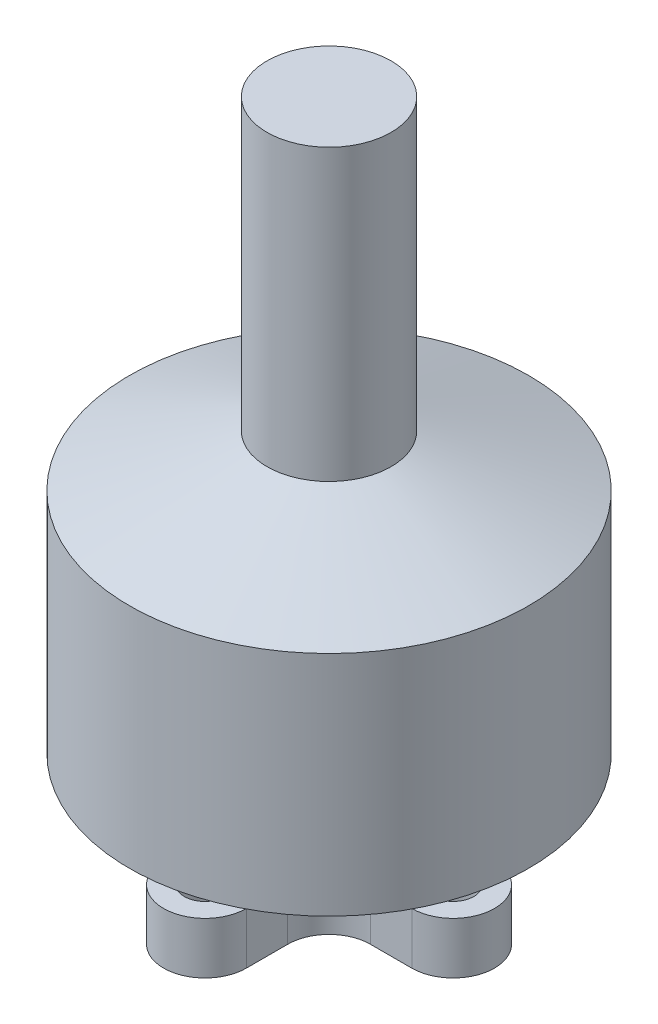
ISO-10303-21;
HEADER;
FILE_DESCRIPTION(('STEP AP214'),'2;1');
FILE_NAME('part.step','',(''),(''),'','','');
FILE_SCHEMA(('AUTOMOTIVE_DESIGN { 1 0 10303 214 1 1 1 1 }'));
ENDSEC;
DATA;
#1=APPLICATION_CONTEXT('core data for automotive mechanical design processes');
#2=APPLICATION_PROTOCOL_DEFINITION('international standard','automotive_design',2000,#1);
#3=PRODUCT_CONTEXT('',#1,'mechanical');
#4=PRODUCT('Part','Part','',(#3));
#5=PRODUCT_RELATED_PRODUCT_CATEGORY('part','',(#4));
#6=PRODUCT_DEFINITION_FORMATION('','',#4);
#7=PRODUCT_DEFINITION_CONTEXT('part definition',#1,'design');
#8=PRODUCT_DEFINITION('design','',#6,#7);
#9=PRODUCT_DEFINITION_SHAPE('','',#8);
#10=(LENGTH_UNIT() NAMED_UNIT(*) SI_UNIT(.MILLI.,.METRE.));
#11=(NAMED_UNIT(*) PLANE_ANGLE_UNIT() SI_UNIT($,.RADIAN.));
#12=(NAMED_UNIT(*) SI_UNIT($,.STERADIAN.) SOLID_ANGLE_UNIT());
#13=UNCERTAINTY_MEASURE_WITH_UNIT(LENGTH_MEASURE(1.E-05),#10,'distance_accuracy_value','');
#14=(GEOMETRIC_REPRESENTATION_CONTEXT(3) GLOBAL_UNCERTAINTY_ASSIGNED_CONTEXT((#13)) GLOBAL_UNIT_ASSIGNED_CONTEXT((#10,
#11,#12)) REPRESENTATION_CONTEXT('',''));
#15=CARTESIAN_POINT('',(0.,0.,0.));
#16=DIRECTION('',(0.,0.,1.));
#17=DIRECTION('',(1.,0.,0.));
#18=AXIS2_PLACEMENT_3D('',#15,#16,#17);
#19=CARTESIAN_POINT('',(0.,2.5,2.));
#20=DIRECTION('',(0.,0.,-1.));
#21=DIRECTION('',(-1.,0.,0.));
#22=AXIS2_PLACEMENT_3D('',#19,#20,#21);
#23=PLANE('',#22);
#24=DIRECTION('',(1.,0.,0.));
#25=VECTOR('',#24,1.);
#26=CARTESIAN_POINT('',(0.,0.,2.));
#27=LINE('',#26,#25);
#28=CARTESIAN_POINT('',(-6.,0.,2.));
#29=VERTEX_POINT('',#28);
#30=CARTESIAN_POINT('',(-4.,0.,2.));
#31=VERTEX_POINT('',#30);
#32=EDGE_CURVE('E217',#29,#31,#27,.T.);
#33=ORIENTED_EDGE('',*,*,#32,.T.);
#34=DIRECTION('',(0.,-1.,0.));
#35=VECTOR('',#34,1.);
#36=CARTESIAN_POINT('',(-4.,2.5,2.));
#37=LINE('',#36,#35);
#38=CARTESIAN_POINT('',(-4.,2.5,2.));
#39=VERTEX_POINT('',#38);
#40=EDGE_CURVE('E56',#31,#39,#37,.F.);
#41=ORIENTED_EDGE('',*,*,#40,.T.);
#42=DIRECTION('',(1.,0.,0.));
#43=VECTOR('',#42,1.);
#44=CARTESIAN_POINT('',(0.,2.5,2.));
#45=LINE('',#44,#43);
#46=CARTESIAN_POINT('',(-6.,2.5,2.));
#47=VERTEX_POINT('',#46);
#48=EDGE_CURVE('E167',#47,#39,#45,.T.);
#49=ORIENTED_EDGE('',*,*,#48,.F.);
#50=DIRECTION('',(0.,-1.,0.));
#51=VECTOR('',#50,1.);
#52=CARTESIAN_POINT('',(-6.,2.5,2.));
#53=LINE('',#52,#51);
#54=EDGE_CURVE('E216',#47,#29,#53,.T.);
#55=ORIENTED_EDGE('',*,*,#54,.T.);
#56=EDGE_LOOP('',(#33,#41,#49,#55));
#57=FACE_BOUND('',#56,.T.);
#58=ADVANCED_FACE('F41',(#57),#23,.F.);
#59=CARTESIAN_POINT('',(-2.,2.5,0.));
#60=DIRECTION('',(1.,0.,0.));
#61=DIRECTION('',(0.,0.,-1.));
#62=AXIS2_PLACEMENT_3D('',#59,#60,#61);
#63=PLANE('',#62);
#64=DIRECTION('',(0.,0.,1.));
#65=VECTOR('',#64,1.);
#66=CARTESIAN_POINT('',(-2.,2.5,0.));
#67=LINE('',#66,#65);
#68=CARTESIAN_POINT('',(-2.,2.5,4.));
#69=VERTEX_POINT('',#68);
#70=CARTESIAN_POINT('',(-2.,2.5,6.));
#71=VERTEX_POINT('',#70);
#72=EDGE_CURVE('E155',#69,#71,#67,.T.);
#73=ORIENTED_EDGE('',*,*,#72,.F.);
#74=DIRECTION('',(0.,-1.,0.));
#75=VECTOR('',#74,1.);
#76=CARTESIAN_POINT('',(-2.,0.,4.));
#77=LINE('',#76,#75);
#78=CARTESIAN_POINT('',(-2.,0.,4.));
#79=VERTEX_POINT('',#78);
#80=EDGE_CURVE('E288',#69,#79,#77,.T.);
#81=ORIENTED_EDGE('',*,*,#80,.T.);
#82=DIRECTION('',(0.,0.,1.));
#83=VECTOR('',#82,1.);
#84=CARTESIAN_POINT('',(-2.,0.,0.));
#85=LINE('',#84,#83);
#86=CARTESIAN_POINT('',(-2.,0.,6.));
#87=VERTEX_POINT('',#86);
#88=EDGE_CURVE('E172',#79,#87,#85,.T.);
#89=ORIENTED_EDGE('',*,*,#88,.T.);
#90=DIRECTION('',(0.,-1.,0.));
#91=VECTOR('',#90,1.);
#92=CARTESIAN_POINT('',(-2.,2.5,6.));
#93=LINE('',#92,#91);
#94=EDGE_CURVE('E170',#71,#87,#93,.T.);
#95=ORIENTED_EDGE('',*,*,#94,.F.);
#96=EDGE_LOOP('',(#73,#81,#89,#95));
#97=FACE_BOUND('',#96,.T.);
#98=ADVANCED_FACE('F171',(#97),#63,.F.);
#99=CARTESIAN_POINT('',(0.,2.5,6.));
#100=DIRECTION('',(0.,-1.,0.));
#101=DIRECTION('',(0.,0.,-1.));
#102=AXIS2_PLACEMENT_3D('',#99,#100,#101);
#103=CYLINDRICAL_SURFACE('',#102,2.);
#104=CARTESIAN_POINT('',(0.,0.,6.));
#105=DIRECTION('',(0.,1.,0.));
#106=DIRECTION('',(0.,0.,1.));
#107=AXIS2_PLACEMENT_3D('',#104,#105,#106);
#108=CIRCLE('',#107,2.);
#109=CARTESIAN_POINT('',(2.,0.,6.));
#110=VERTEX_POINT('',#109);
#111=EDGE_CURVE('E221',#87,#110,#108,.T.);
#112=ORIENTED_EDGE('',*,*,#111,.T.);
#113=DIRECTION('',(0.,-1.,0.));
#114=VECTOR('',#113,1.);
#115=CARTESIAN_POINT('',(2.,2.5,6.));
#116=LINE('',#115,#114);
#117=CARTESIAN_POINT('',(2.,2.5,6.));
#118=VERTEX_POINT('',#117);
#119=EDGE_CURVE('E176',#118,#110,#116,.T.);
#120=ORIENTED_EDGE('',*,*,#119,.F.);
#121=CARTESIAN_POINT('',(0.,2.5,6.));
#122=DIRECTION('',(0.,1.,0.));
#123=DIRECTION('',(0.,0.,1.));
#124=AXIS2_PLACEMENT_3D('',#121,#122,#123);
#125=CIRCLE('',#124,2.);
#126=EDGE_CURVE('E161',#71,#118,#125,.T.);
#127=ORIENTED_EDGE('',*,*,#126,.F.);
#128=ORIENTED_EDGE('',*,*,#94,.T.);
#129=EDGE_LOOP('',(#112,#120,#127,#128));
#130=FACE_BOUND('',#129,.T.);
#131=ADVANCED_FACE('F178',(#130),#103,.T.);
#132=CARTESIAN_POINT('',(2.,2.5,0.));
#133=DIRECTION('',(-1.,0.,0.));
#134=DIRECTION('',(0.,0.,1.));
#135=AXIS2_PLACEMENT_3D('',#132,#133,#134);
#136=PLANE('',#135);
#137=DIRECTION('',(0.,0.,-1.));
#138=VECTOR('',#137,1.);
#139=CARTESIAN_POINT('',(2.,0.,0.));
#140=LINE('',#139,#138);
#141=CARTESIAN_POINT('',(2.,0.,4.));
#142=VERTEX_POINT('',#141);
#143=EDGE_CURVE('E223',#110,#142,#140,.T.);
#144=ORIENTED_EDGE('',*,*,#143,.T.);
#145=DIRECTION('',(0.,-1.,0.));
#146=VECTOR('',#145,1.);
#147=CARTESIAN_POINT('',(2.,2.5,4.));
#148=LINE('',#147,#146);
#149=CARTESIAN_POINT('',(2.,2.5,4.));
#150=VERTEX_POINT('',#149);
#151=EDGE_CURVE('E286',#142,#150,#148,.F.);
#152=ORIENTED_EDGE('',*,*,#151,.T.);
#153=DIRECTION('',(0.,0.,-1.));
#154=VECTOR('',#153,1.);
#155=CARTESIAN_POINT('',(2.,2.5,0.));
#156=LINE('',#155,#154);
#157=EDGE_CURVE('E181',#118,#150,#156,.T.);
#158=ORIENTED_EDGE('',*,*,#157,.F.);
#159=ORIENTED_EDGE('',*,*,#119,.T.);
#160=EDGE_LOOP('',(#144,#152,#158,#159));
#161=FACE_BOUND('',#160,.T.);
#162=ADVANCED_FACE('F319',(#161),#136,.F.);
#163=CARTESIAN_POINT('',(0.,2.5,2.));
#164=DIRECTION('',(0.,0.,-1.));
#165=DIRECTION('',(-1.,0.,0.));
#166=AXIS2_PLACEMENT_3D('',#163,#164,#165);
#167=PLANE('',#166);
#168=DIRECTION('',(1.,0.,0.));
#169=VECTOR('',#168,1.);
#170=CARTESIAN_POINT('',(0.,2.5,2.));
#171=LINE('',#170,#169);
#172=CARTESIAN_POINT('',(4.,2.5,2.));
#173=VERTEX_POINT('',#172);
#174=CARTESIAN_POINT('',(6.,2.5,2.));
#175=VERTEX_POINT('',#174);
#176=EDGE_CURVE('E183',#173,#175,#171,.T.);
#177=ORIENTED_EDGE('',*,*,#176,.F.);
#178=DIRECTION('',(0.,-1.,0.));
#179=VECTOR('',#178,1.);
#180=CARTESIAN_POINT('',(4.,0.,2.));
#181=LINE('',#180,#179);
#182=CARTESIAN_POINT('',(4.,0.,2.));
#183=VERTEX_POINT('',#182);
#184=EDGE_CURVE('E283',#173,#183,#181,.T.);
#185=ORIENTED_EDGE('',*,*,#184,.T.);
#186=DIRECTION('',(1.,0.,0.));
#187=VECTOR('',#186,1.);
#188=CARTESIAN_POINT('',(0.,0.,2.));
#189=LINE('',#188,#187);
#190=CARTESIAN_POINT('',(6.,0.,2.));
#191=VERTEX_POINT('',#190);
#192=EDGE_CURVE('E226',#183,#191,#189,.T.);
#193=ORIENTED_EDGE('',*,*,#192,.T.);
#194=DIRECTION('',(0.,-1.,0.));
#195=VECTOR('',#194,1.);
#196=CARTESIAN_POINT('',(6.,2.5,2.));
#197=LINE('',#196,#195);
#198=EDGE_CURVE('E270',#175,#191,#197,.T.);
#199=ORIENTED_EDGE('',*,*,#198,.F.);
#200=EDGE_LOOP('',(#177,#185,#193,#199));
#201=FACE_BOUND('',#200,.T.);
#202=ADVANCED_FACE('F310',(#201),#167,.F.);
#203=CARTESIAN_POINT('',(6.,2.5,0.));
#204=DIRECTION('',(0.,-1.,0.));
#205=DIRECTION('',(0.,0.,-1.));
#206=AXIS2_PLACEMENT_3D('',#203,#204,#205);
#207=CYLINDRICAL_SURFACE('',#206,2.);
#208=CARTESIAN_POINT('',(6.,0.,0.));
#209=DIRECTION('',(0.,1.,0.));
#210=DIRECTION('',(0.,0.,1.));
#211=AXIS2_PLACEMENT_3D('',#208,#209,#210);
#212=CIRCLE('',#211,2.);
#213=CARTESIAN_POINT('',(6.,0.,-2.));
#214=VERTEX_POINT('',#213);
#215=EDGE_CURVE('E228',#191,#214,#212,.T.);
#216=ORIENTED_EDGE('',*,*,#215,.T.);
#217=DIRECTION('',(0.,-1.,0.));
#218=VECTOR('',#217,1.);
#219=CARTESIAN_POINT('',(6.,2.5,-2.));
#220=LINE('',#219,#218);
#221=CARTESIAN_POINT('',(6.,2.5,-2.));
#222=VERTEX_POINT('',#221);
#223=EDGE_CURVE('E267',#222,#214,#220,.T.);
#224=ORIENTED_EDGE('',*,*,#223,.F.);
#225=CARTESIAN_POINT('',(6.,2.5,0.));
#226=DIRECTION('',(0.,1.,0.));
#227=DIRECTION('',(0.,0.,1.));
#228=AXIS2_PLACEMENT_3D('',#225,#226,#227);
#229=CIRCLE('',#228,2.);
#230=EDGE_CURVE('E188',#175,#222,#229,.T.);
#231=ORIENTED_EDGE('',*,*,#230,.F.);
#232=ORIENTED_EDGE('',*,*,#198,.T.);
#233=EDGE_LOOP('',(#216,#224,#231,#232));
#234=FACE_BOUND('',#233,.T.);
#235=ADVANCED_FACE('F326',(#234),#207,.T.);
#236=CARTESIAN_POINT('',(0.,2.5,-2.));
#237=DIRECTION('',(0.,0.,1.));
#238=DIRECTION('',(1.,0.,0.));
#239=AXIS2_PLACEMENT_3D('',#236,#237,#238);
#240=PLANE('',#239);
#241=DIRECTION('',(-1.,0.,0.));
#242=VECTOR('',#241,1.);
#243=CARTESIAN_POINT('',(0.,0.,-2.));
#244=LINE('',#243,#242);
#245=CARTESIAN_POINT('',(4.,0.,-2.));
#246=VERTEX_POINT('',#245);
#247=EDGE_CURVE('E230',#214,#246,#244,.T.);
#248=ORIENTED_EDGE('',*,*,#247,.T.);
#249=DIRECTION('',(0.,-1.,0.));
#250=VECTOR('',#249,1.);
#251=CARTESIAN_POINT('',(4.,2.5,-2.));
#252=LINE('',#251,#250);
#253=CARTESIAN_POINT('',(4.,2.5,-2.));
#254=VERTEX_POINT('',#253);
#255=EDGE_CURVE('E281',#246,#254,#252,.F.);
#256=ORIENTED_EDGE('',*,*,#255,.T.);
#257=DIRECTION('',(-1.,0.,0.));
#258=VECTOR('',#257,1.);
#259=CARTESIAN_POINT('',(0.,2.5,-2.));
#260=LINE('',#259,#258);
#261=EDGE_CURVE('E190',#222,#254,#260,.T.);
#262=ORIENTED_EDGE('',*,*,#261,.F.);
#263=ORIENTED_EDGE('',*,*,#223,.T.);
#264=EDGE_LOOP('',(#248,#256,#262,#263));
#265=FACE_BOUND('',#264,.T.);
#266=ADVANCED_FACE('F405',(#265),#240,.F.);
#267=CARTESIAN_POINT('',(2.,2.5,0.));
#268=DIRECTION('',(-1.,0.,0.));
#269=DIRECTION('',(0.,0.,1.));
#270=AXIS2_PLACEMENT_3D('',#267,#268,#269);
#271=PLANE('',#270);
#272=DIRECTION('',(0.,0.,-1.));
#273=VECTOR('',#272,1.);
#274=CARTESIAN_POINT('',(2.,2.5,0.));
#275=LINE('',#274,#273);
#276=CARTESIAN_POINT('',(2.,2.5,-4.));
#277=VERTEX_POINT('',#276);
#278=CARTESIAN_POINT('',(2.,2.5,-6.));
#279=VERTEX_POINT('',#278);
#280=EDGE_CURVE('E193',#277,#279,#275,.T.);
#281=ORIENTED_EDGE('',*,*,#280,.F.);
#282=DIRECTION('',(0.,-1.,0.));
#283=VECTOR('',#282,1.);
#284=CARTESIAN_POINT('',(2.,0.,-4.));
#285=LINE('',#284,#283);
#286=CARTESIAN_POINT('',(2.,0.,-4.));
#287=VERTEX_POINT('',#286);
#288=EDGE_CURVE('E278',#277,#287,#285,.T.);
#289=ORIENTED_EDGE('',*,*,#288,.T.);
#290=DIRECTION('',(0.,0.,-1.));
#291=VECTOR('',#290,1.);
#292=CARTESIAN_POINT('',(2.,0.,0.));
#293=LINE('',#292,#291);
#294=CARTESIAN_POINT('',(2.,0.,-6.));
#295=VERTEX_POINT('',#294);
#296=EDGE_CURVE('E233',#287,#295,#293,.T.);
#297=ORIENTED_EDGE('',*,*,#296,.T.);
#298=DIRECTION('',(0.,-1.,0.));
#299=VECTOR('',#298,1.);
#300=CARTESIAN_POINT('',(2.,2.5,-6.));
#301=LINE('',#300,#299);
#302=EDGE_CURVE('E264',#279,#295,#301,.T.);
#303=ORIENTED_EDGE('',*,*,#302,.F.);
#304=EDGE_LOOP('',(#281,#289,#297,#303));
#305=FACE_BOUND('',#304,.T.);
#306=ADVANCED_FACE('F401',(#305),#271,.F.);
#307=CARTESIAN_POINT('',(0.,2.5,-6.));
#308=DIRECTION('',(0.,-1.,0.));
#309=DIRECTION('',(0.,0.,-1.));
#310=AXIS2_PLACEMENT_3D('',#307,#308,#309);
#311=CYLINDRICAL_SURFACE('',#310,2.);
#312=CARTESIAN_POINT('',(0.,0.,-6.));
#313=DIRECTION('',(0.,1.,0.));
#314=DIRECTION('',(0.,0.,1.));
#315=AXIS2_PLACEMENT_3D('',#312,#313,#314);
#316=CIRCLE('',#315,2.);
#317=CARTESIAN_POINT('',(-2.,0.,-6.));
#318=VERTEX_POINT('',#317);
#319=EDGE_CURVE('E235',#295,#318,#316,.T.);
#320=ORIENTED_EDGE('',*,*,#319,.T.);
#321=DIRECTION('',(0.,-1.,0.));
#322=VECTOR('',#321,1.);
#323=CARTESIAN_POINT('',(-2.,2.5,-6.));
#324=LINE('',#323,#322);
#325=CARTESIAN_POINT('',(-2.,2.5,-6.));
#326=VERTEX_POINT('',#325);
#327=EDGE_CURVE('E261',#326,#318,#324,.T.);
#328=ORIENTED_EDGE('',*,*,#327,.F.);
#329=CARTESIAN_POINT('',(0.,2.5,-6.));
#330=DIRECTION('',(0.,1.,0.));
#331=DIRECTION('',(0.,0.,1.));
#332=AXIS2_PLACEMENT_3D('',#329,#330,#331);
#333=CIRCLE('',#332,2.);
#334=EDGE_CURVE('E195',#279,#326,#333,.T.);
#335=ORIENTED_EDGE('',*,*,#334,.F.);
#336=ORIENTED_EDGE('',*,*,#302,.T.);
#337=EDGE_LOOP('',(#320,#328,#335,#336));
#338=FACE_BOUND('',#337,.T.);
#339=ADVANCED_FACE('F397',(#338),#311,.T.);
#340=CARTESIAN_POINT('',(-2.,2.5,0.));
#341=DIRECTION('',(1.,0.,0.));
#342=DIRECTION('',(0.,0.,-1.));
#343=AXIS2_PLACEMENT_3D('',#340,#341,#342);
#344=PLANE('',#343);
#345=DIRECTION('',(0.,0.,1.));
#346=VECTOR('',#345,1.);
#347=CARTESIAN_POINT('',(-2.,0.,0.));
#348=LINE('',#347,#346);
#349=CARTESIAN_POINT('',(-2.,0.,-4.));
#350=VERTEX_POINT('',#349);
#351=EDGE_CURVE('E237',#318,#350,#348,.T.);
#352=ORIENTED_EDGE('',*,*,#351,.T.);
#353=DIRECTION('',(0.,-1.,0.));
#354=VECTOR('',#353,1.);
#355=CARTESIAN_POINT('',(-2.,2.5,-4.));
#356=LINE('',#355,#354);
#357=CARTESIAN_POINT('',(-2.,2.5,-4.));
#358=VERTEX_POINT('',#357);
#359=EDGE_CURVE('E276',#350,#358,#356,.F.);
#360=ORIENTED_EDGE('',*,*,#359,.T.);
#361=DIRECTION('',(0.,0.,1.));
#362=VECTOR('',#361,1.);
#363=CARTESIAN_POINT('',(-2.,2.5,0.));
#364=LINE('',#363,#362);
#365=EDGE_CURVE('E197',#326,#358,#364,.T.);
#366=ORIENTED_EDGE('',*,*,#365,.F.);
#367=ORIENTED_EDGE('',*,*,#327,.T.);
#368=EDGE_LOOP('',(#352,#360,#366,#367));
#369=FACE_BOUND('',#368,.T.);
#370=ADVANCED_FACE('F393',(#369),#344,.F.);
#371=CARTESIAN_POINT('',(0.,2.5,-2.));
#372=DIRECTION('',(0.,0.,1.));
#373=DIRECTION('',(1.,0.,0.));
#374=AXIS2_PLACEMENT_3D('',#371,#372,#373);
#375=PLANE('',#374);
#376=DIRECTION('',(-1.,0.,0.));
#377=VECTOR('',#376,1.);
#378=CARTESIAN_POINT('',(0.,2.5,-2.));
#379=LINE('',#378,#377);
#380=CARTESIAN_POINT('',(-4.,2.5,-2.));
#381=VERTEX_POINT('',#380);
#382=CARTESIAN_POINT('',(-6.,2.5,-2.));
#383=VERTEX_POINT('',#382);
#384=EDGE_CURVE('E200',#381,#383,#379,.T.);
#385=ORIENTED_EDGE('',*,*,#384,.F.);
#386=DIRECTION('',(0.,-1.,0.));
#387=VECTOR('',#386,1.);
#388=CARTESIAN_POINT('',(-4.,0.,-2.));
#389=LINE('',#388,#387);
#390=CARTESIAN_POINT('',(-4.,0.,-2.));
#391=VERTEX_POINT('',#390);
#392=EDGE_CURVE('E175',#381,#391,#389,.T.);
#393=ORIENTED_EDGE('',*,*,#392,.T.);
#394=DIRECTION('',(-1.,0.,0.));
#395=VECTOR('',#394,1.);
#396=CARTESIAN_POINT('',(0.,0.,-2.));
#397=LINE('',#396,#395);
#398=CARTESIAN_POINT('',(-6.,0.,-2.));
#399=VERTEX_POINT('',#398);
#400=EDGE_CURVE('E240',#391,#399,#397,.T.);
#401=ORIENTED_EDGE('',*,*,#400,.T.);
#402=DIRECTION('',(0.,-1.,0.));
#403=VECTOR('',#402,1.);
#404=CARTESIAN_POINT('',(-6.,2.5,-2.));
#405=LINE('',#404,#403);
#406=EDGE_CURVE('E258',#383,#399,#405,.T.);
#407=ORIENTED_EDGE('',*,*,#406,.F.);
#408=EDGE_LOOP('',(#385,#393,#401,#407));
#409=FACE_BOUND('',#408,.T.);
#410=ADVANCED_FACE('F379',(#409),#375,.F.);
#411=CARTESIAN_POINT('',(6.,2.5,0.));
#412=DIRECTION('',(0.,-1.,0.));
#413=DIRECTION('',(0.,0.,-1.));
#414=AXIS2_PLACEMENT_3D('',#411,#412,#413);
#415=CYLINDRICAL_SURFACE('',#414,1.);
#416=CARTESIAN_POINT('',(6.,2.5,0.));
#417=DIRECTION('',(0.,1.,0.));
#418=DIRECTION('',(0.,0.,1.));
#419=AXIS2_PLACEMENT_3D('',#416,#417,#418);
#420=CIRCLE('',#419,1.);
#421=CARTESIAN_POINT('',(6.,2.5,1.));
#422=VERTEX_POINT('',#421);
#423=EDGE_CURVE('E210',#422,#422,#420,.T.);
#424=ORIENTED_EDGE('',*,*,#423,.T.);
#425=EDGE_LOOP('',(#424));
#426=FACE_BOUND('',#425,.T.);
#427=CARTESIAN_POINT('',(6.,0.,0.));
#428=DIRECTION('',(0.,1.,0.));
#429=DIRECTION('',(0.,0.,1.));
#430=AXIS2_PLACEMENT_3D('',#427,#428,#429);
#431=CIRCLE('',#430,1.);
#432=CARTESIAN_POINT('',(6.,0.,1.));
#433=VERTEX_POINT('',#432);
#434=EDGE_CURVE('E250',#433,#433,#431,.T.);
#435=ORIENTED_EDGE('',*,*,#434,.F.);
#436=EDGE_LOOP('',(#435));
#437=FACE_BOUND('',#436,.T.);
#438=ADVANCED_FACE('F375',(#426,#437),#415,.F.);
#439=CARTESIAN_POINT('',(0.,2.5,-6.));
#440=DIRECTION('',(0.,-1.,0.));
#441=DIRECTION('',(0.,0.,-1.));
#442=AXIS2_PLACEMENT_3D('',#439,#440,#441);
#443=CYLINDRICAL_SURFACE('',#442,1.);
#444=CARTESIAN_POINT('',(0.,2.5,-6.));
#445=DIRECTION('',(0.,1.,0.));
#446=DIRECTION('',(0.,0.,1.));
#447=AXIS2_PLACEMENT_3D('',#444,#445,#446);
#448=CIRCLE('',#447,1.);
#449=CARTESIAN_POINT('',(0.,2.5,-5.));
#450=VERTEX_POINT('',#449);
#451=EDGE_CURVE('E207',#450,#450,#448,.T.);
#452=ORIENTED_EDGE('',*,*,#451,.T.);
#453=EDGE_LOOP('',(#452));
#454=FACE_BOUND('',#453,.T.);
#455=CARTESIAN_POINT('',(0.,0.,-6.));
#456=DIRECTION('',(0.,1.,0.));
#457=DIRECTION('',(0.,0.,1.));
#458=AXIS2_PLACEMENT_3D('',#455,#456,#457);
#459=CIRCLE('',#458,1.);
#460=CARTESIAN_POINT('',(0.,0.,-5.));
#461=VERTEX_POINT('',#460);
#462=EDGE_CURVE('E247',#461,#461,#459,.T.);
#463=ORIENTED_EDGE('',*,*,#462,.F.);
#464=EDGE_LOOP('',(#463));
#465=FACE_BOUND('',#464,.T.);
#466=ADVANCED_FACE('F378',(#454,#465),#443,.F.);
#467=CARTESIAN_POINT('',(-6.,2.5,0.));
#468=DIRECTION('',(0.,-1.,0.));
#469=DIRECTION('',(0.,0.,-1.));
#470=AXIS2_PLACEMENT_3D('',#467,#468,#469);
#471=CYLINDRICAL_SURFACE('',#470,1.);
#472=CARTESIAN_POINT('',(-6.,2.5,0.));
#473=DIRECTION('',(0.,1.,0.));
#474=DIRECTION('',(0.,0.,1.));
#475=AXIS2_PLACEMENT_3D('',#472,#473,#474);
#476=CIRCLE('',#475,1.);
#477=CARTESIAN_POINT('',(-6.,2.5,1.));
#478=VERTEX_POINT('',#477);
#479=EDGE_CURVE('E204',#478,#478,#476,.T.);
#480=ORIENTED_EDGE('',*,*,#479,.T.);
#481=EDGE_LOOP('',(#480));
#482=FACE_BOUND('',#481,.T.);
#483=CARTESIAN_POINT('',(-6.,0.,0.));
#484=DIRECTION('',(0.,1.,0.));
#485=DIRECTION('',(0.,0.,1.));
#486=AXIS2_PLACEMENT_3D('',#483,#484,#485);
#487=CIRCLE('',#486,1.);
#488=CARTESIAN_POINT('',(-6.,0.,1.));
#489=VERTEX_POINT('',#488);
#490=EDGE_CURVE('E244',#489,#489,#487,.T.);
#491=ORIENTED_EDGE('',*,*,#490,.F.);
#492=EDGE_LOOP('',(#491));
#493=FACE_BOUND('',#492,.T.);
#494=ADVANCED_FACE('F383',(#482,#493),#471,.F.);
#495=CARTESIAN_POINT('',(-6.,2.5,0.));
#496=DIRECTION('',(0.,-1.,0.));
#497=DIRECTION('',(0.,0.,-1.));
#498=AXIS2_PLACEMENT_3D('',#495,#496,#497);
#499=CYLINDRICAL_SURFACE('',#498,2.);
#500=CARTESIAN_POINT('',(-6.,0.,0.));
#501=DIRECTION('',(0.,1.,0.));
#502=DIRECTION('',(0.,0.,1.));
#503=AXIS2_PLACEMENT_3D('',#500,#501,#502);
#504=CIRCLE('',#503,2.);
#505=EDGE_CURVE('E242',#399,#29,#504,.T.);
#506=ORIENTED_EDGE('',*,*,#505,.T.);
#507=ORIENTED_EDGE('',*,*,#54,.F.);
#508=CARTESIAN_POINT('',(-6.,2.5,0.));
#509=DIRECTION('',(0.,1.,0.));
#510=DIRECTION('',(0.,0.,1.));
#511=AXIS2_PLACEMENT_3D('',#508,#509,#510);
#512=CIRCLE('',#511,2.);
#513=EDGE_CURVE('E202',#383,#47,#512,.T.);
#514=ORIENTED_EDGE('',*,*,#513,.F.);
#515=ORIENTED_EDGE('',*,*,#406,.T.);
#516=EDGE_LOOP('',(#506,#507,#514,#515));
#517=FACE_BOUND('',#516,.T.);
#518=ADVANCED_FACE('F373',(#517),#499,.T.);
#519=CARTESIAN_POINT('',(0.,2.5,6.));
#520=DIRECTION('',(0.,-1.,0.));
#521=DIRECTION('',(0.,0.,-1.));
#522=AXIS2_PLACEMENT_3D('',#519,#520,#521);
#523=CYLINDRICAL_SURFACE('',#522,1.);
#524=CARTESIAN_POINT('',(0.,2.5,6.));
#525=DIRECTION('',(0.,1.,0.));
#526=DIRECTION('',(0.,0.,1.));
#527=AXIS2_PLACEMENT_3D('',#524,#525,#526);
#528=CIRCLE('',#527,1.);
#529=CARTESIAN_POINT('',(0.,2.5,7.));
#530=VERTEX_POINT('',#529);
#531=EDGE_CURVE('E213',#530,#530,#528,.T.);
#532=ORIENTED_EDGE('',*,*,#531,.T.);
#533=EDGE_LOOP('',(#532));
#534=FACE_BOUND('',#533,.T.);
#535=CARTESIAN_POINT('',(0.,0.,6.));
#536=DIRECTION('',(0.,1.,0.));
#537=DIRECTION('',(0.,0.,1.));
#538=AXIS2_PLACEMENT_3D('',#535,#536,#537);
#539=CIRCLE('',#538,1.);
#540=CARTESIAN_POINT('',(0.,0.,7.));
#541=VERTEX_POINT('',#540);
#542=EDGE_CURVE('E253',#541,#541,#539,.T.);
#543=ORIENTED_EDGE('',*,*,#542,.F.);
#544=EDGE_LOOP('',(#543));
#545=FACE_BOUND('',#544,.T.);
#546=ADVANCED_FACE('F367',(#534,#545),#523,.F.);
#547=CARTESIAN_POINT('',(0.,2.5,0.));
#548=DIRECTION('',(0.,1.,0.));
#549=DIRECTION('',(0.,0.,1.));
#550=AXIS2_PLACEMENT_3D('',#547,#548,#549);
#551=PLANE('',#550);
#552=CARTESIAN_POINT('',(0.,2.5,0.));
#553=DIRECTION('',(0.,1.,0.));
#554=DIRECTION('',(0.,0.,1.));
#555=AXIS2_PLACEMENT_3D('',#552,#553,#554);
#556=CIRCLE('',#555,3.5);
#557=CARTESIAN_POINT('',(0.,2.5,3.5));
#558=VERTEX_POINT('',#557);
#559=EDGE_CURVE('E11',#558,#558,#556,.T.);
#560=ORIENTED_EDGE('',*,*,#559,.F.);
#561=EDGE_LOOP('',(#560));
#562=FACE_BOUND('',#561,.T.);
#563=ORIENTED_EDGE('',*,*,#48,.T.);
#564=CARTESIAN_POINT('',(-4.,2.5,4.));
#565=DIRECTION('',(0.,1.,0.));
#566=DIRECTION('',(0.,0.,1.));
#567=AXIS2_PLACEMENT_3D('',#564,#565,#566);
#568=CIRCLE('',#567,2.);
#569=EDGE_CURVE('E49',#39,#69,#568,.F.);
#570=ORIENTED_EDGE('',*,*,#569,.T.);
#571=ORIENTED_EDGE('',*,*,#72,.T.);
#572=ORIENTED_EDGE('',*,*,#126,.T.);
#573=ORIENTED_EDGE('',*,*,#157,.T.);
#574=CARTESIAN_POINT('',(4.,2.5,4.));
#575=DIRECTION('',(0.,1.,0.));
#576=DIRECTION('',(0.,0.,1.));
#577=AXIS2_PLACEMENT_3D('',#574,#575,#576);
#578=CIRCLE('',#577,2.);
#579=EDGE_CURVE('E301',#150,#173,#578,.F.);
#580=ORIENTED_EDGE('',*,*,#579,.T.);
#581=ORIENTED_EDGE('',*,*,#176,.T.);
#582=ORIENTED_EDGE('',*,*,#230,.T.);
#583=ORIENTED_EDGE('',*,*,#261,.T.);
#584=CARTESIAN_POINT('',(4.,2.5,-4.));
#585=DIRECTION('',(0.,1.,0.));
#586=DIRECTION('',(0.,0.,1.));
#587=AXIS2_PLACEMENT_3D('',#584,#585,#586);
#588=CIRCLE('',#587,2.);
#589=EDGE_CURVE('E297',#254,#277,#588,.F.);
#590=ORIENTED_EDGE('',*,*,#589,.T.);
#591=ORIENTED_EDGE('',*,*,#280,.T.);
#592=ORIENTED_EDGE('',*,*,#334,.T.);
#593=ORIENTED_EDGE('',*,*,#365,.T.);
#594=CARTESIAN_POINT('',(-4.,2.5,-4.));
#595=DIRECTION('',(0.,1.,0.));
#596=DIRECTION('',(0.,0.,1.));
#597=AXIS2_PLACEMENT_3D('',#594,#595,#596);
#598=CIRCLE('',#597,2.);
#599=EDGE_CURVE('E293',#358,#381,#598,.F.);
#600=ORIENTED_EDGE('',*,*,#599,.T.);
#601=ORIENTED_EDGE('',*,*,#384,.T.);
#602=ORIENTED_EDGE('',*,*,#513,.T.);
#603=EDGE_LOOP('',(#563,#570,#571,#572,#573,#580,#581,#582,#583,#590,#591,#592,#593,#600,#601,#602));
#604=FACE_BOUND('',#603,.T.);
#605=ORIENTED_EDGE('',*,*,#479,.F.);
#606=EDGE_LOOP('',(#605));
#607=FACE_BOUND('',#606,.T.);
#608=ORIENTED_EDGE('',*,*,#451,.F.);
#609=EDGE_LOOP('',(#608));
#610=FACE_BOUND('',#609,.T.);
#611=ORIENTED_EDGE('',*,*,#423,.F.);
#612=EDGE_LOOP('',(#611));
#613=FACE_BOUND('',#612,.T.);
#614=ORIENTED_EDGE('',*,*,#531,.F.);
#615=EDGE_LOOP('',(#614));
#616=FACE_BOUND('',#615,.T.);
#617=ADVANCED_FACE('F157',(#562,#604,#607,#610,#613,#616),#551,.T.);
#618=CARTESIAN_POINT('',(0.,0.,0.));
#619=DIRECTION('',(0.,1.,0.));
#620=DIRECTION('',(0.,0.,1.));
#621=AXIS2_PLACEMENT_3D('',#618,#619,#620);
#622=PLANE('',#621);
#623=ORIENTED_EDGE('',*,*,#32,.F.);
#624=ORIENTED_EDGE('',*,*,#505,.F.);
#625=ORIENTED_EDGE('',*,*,#400,.F.);
#626=CARTESIAN_POINT('',(-4.,0.,-4.));
#627=DIRECTION('',(0.,1.,0.));
#628=DIRECTION('',(0.,0.,1.));
#629=AXIS2_PLACEMENT_3D('',#626,#627,#628);
#630=CIRCLE('',#629,2.);
#631=EDGE_CURVE('E291',#391,#350,#630,.T.);
#632=ORIENTED_EDGE('',*,*,#631,.T.);
#633=ORIENTED_EDGE('',*,*,#351,.F.);
#634=ORIENTED_EDGE('',*,*,#319,.F.);
#635=ORIENTED_EDGE('',*,*,#296,.F.);
#636=CARTESIAN_POINT('',(4.,0.,-4.));
#637=DIRECTION('',(0.,1.,0.));
#638=DIRECTION('',(0.,0.,1.));
#639=AXIS2_PLACEMENT_3D('',#636,#637,#638);
#640=CIRCLE('',#639,2.);
#641=EDGE_CURVE('E295',#287,#246,#640,.T.);
#642=ORIENTED_EDGE('',*,*,#641,.T.);
#643=ORIENTED_EDGE('',*,*,#247,.F.);
#644=ORIENTED_EDGE('',*,*,#215,.F.);
#645=ORIENTED_EDGE('',*,*,#192,.F.);
#646=CARTESIAN_POINT('',(4.,0.,4.));
#647=DIRECTION('',(0.,1.,0.));
#648=DIRECTION('',(0.,0.,1.));
#649=AXIS2_PLACEMENT_3D('',#646,#647,#648);
#650=CIRCLE('',#649,2.);
#651=EDGE_CURVE('E299',#183,#142,#650,.T.);
#652=ORIENTED_EDGE('',*,*,#651,.T.);
#653=ORIENTED_EDGE('',*,*,#143,.F.);
#654=ORIENTED_EDGE('',*,*,#111,.F.);
#655=ORIENTED_EDGE('',*,*,#88,.F.);
#656=CARTESIAN_POINT('',(-4.,0.,4.));
#657=DIRECTION('',(0.,1.,0.));
#658=DIRECTION('',(0.,0.,1.));
#659=AXIS2_PLACEMENT_3D('',#656,#657,#658);
#660=CIRCLE('',#659,2.);
#661=EDGE_CURVE('E64',#79,#31,#660,.T.);
#662=ORIENTED_EDGE('',*,*,#661,.T.);
#663=EDGE_LOOP('',(#623,#624,#625,#632,#633,#634,#635,#642,#643,#644,#645,#652,#653,#654,#655,#662));
#664=FACE_BOUND('',#663,.T.);
#665=ORIENTED_EDGE('',*,*,#490,.T.);
#666=EDGE_LOOP('',(#665));
#667=FACE_BOUND('',#666,.T.);
#668=ORIENTED_EDGE('',*,*,#462,.T.);
#669=EDGE_LOOP('',(#668));
#670=FACE_BOUND('',#669,.T.);
#671=ORIENTED_EDGE('',*,*,#434,.T.);
#672=EDGE_LOOP('',(#671));
#673=FACE_BOUND('',#672,.T.);
#674=ORIENTED_EDGE('',*,*,#542,.T.);
#675=EDGE_LOOP('',(#674));
#676=FACE_BOUND('',#675,.T.);
#677=ADVANCED_FACE('F315',(#664,#667,#670,#673,#676),#622,.F.);
#678=CARTESIAN_POINT('',(-4.,2.5,-4.));
#679=DIRECTION('',(0.,1.,0.));
#680=DIRECTION('',(0.,0.,1.));
#681=AXIS2_PLACEMENT_3D('',#678,#679,#680);
#682=CYLINDRICAL_SURFACE('',#681,2.);
#683=ORIENTED_EDGE('',*,*,#599,.F.);
#684=ORIENTED_EDGE('',*,*,#359,.F.);
#685=ORIENTED_EDGE('',*,*,#631,.F.);
#686=ORIENTED_EDGE('',*,*,#392,.F.);
#687=EDGE_LOOP('',(#683,#684,#685,#686));
#688=FACE_BOUND('',#687,.T.);
#689=ADVANCED_FACE('F336',(#688),#682,.F.);
#690=CARTESIAN_POINT('',(4.,2.5,-4.));
#691=DIRECTION('',(0.,1.,0.));
#692=DIRECTION('',(0.,0.,1.));
#693=AXIS2_PLACEMENT_3D('',#690,#691,#692);
#694=CYLINDRICAL_SURFACE('',#693,2.);
#695=ORIENTED_EDGE('',*,*,#589,.F.);
#696=ORIENTED_EDGE('',*,*,#255,.F.);
#697=ORIENTED_EDGE('',*,*,#641,.F.);
#698=ORIENTED_EDGE('',*,*,#288,.F.);
#699=EDGE_LOOP('',(#695,#696,#697,#698));
#700=FACE_BOUND('',#699,.T.);
#701=ADVANCED_FACE('F339',(#700),#694,.F.);
#702=CARTESIAN_POINT('',(4.,2.5,4.));
#703=DIRECTION('',(0.,1.,0.));
#704=DIRECTION('',(0.,0.,1.));
#705=AXIS2_PLACEMENT_3D('',#702,#703,#704);
#706=CYLINDRICAL_SURFACE('',#705,2.);
#707=ORIENTED_EDGE('',*,*,#579,.F.);
#708=ORIENTED_EDGE('',*,*,#151,.F.);
#709=ORIENTED_EDGE('',*,*,#651,.F.);
#710=ORIENTED_EDGE('',*,*,#184,.F.);
#711=EDGE_LOOP('',(#707,#708,#709,#710));
#712=FACE_BOUND('',#711,.T.);
#713=ADVANCED_FACE('F313',(#712),#706,.F.);
#714=CARTESIAN_POINT('',(-4.,2.5,4.));
#715=DIRECTION('',(0.,1.,0.));
#716=DIRECTION('',(0.,0.,1.));
#717=AXIS2_PLACEMENT_3D('',#714,#715,#716);
#718=CYLINDRICAL_SURFACE('',#717,2.);
#719=ORIENTED_EDGE('',*,*,#569,.F.);
#720=ORIENTED_EDGE('',*,*,#40,.F.);
#721=ORIENTED_EDGE('',*,*,#661,.F.);
#722=ORIENTED_EDGE('',*,*,#80,.F.);
#723=EDGE_LOOP('',(#719,#720,#721,#722));
#724=FACE_BOUND('',#723,.T.);
#725=ADVANCED_FACE('F43',(#724),#718,.F.);
#726=CARTESIAN_POINT('',(0.,2.5,0.));
#727=DIRECTION('',(0.,-1.,0.));
#728=DIRECTION('',(0.,0.,-1.));
#729=AXIS2_PLACEMENT_3D('',#726,#727,#728);
#730=CYLINDRICAL_SURFACE('',#729,3.5);
#731=CARTESIAN_POINT('',(0.,5.,0.));
#732=DIRECTION('',(0.,-1.,0.));
#733=DIRECTION('',(0.,0.,-1.));
#734=AXIS2_PLACEMENT_3D('',#731,#732,#733);
#735=CIRCLE('',#734,3.5);
#736=CARTESIAN_POINT('',(0.,5.,-3.5));
#737=VERTEX_POINT('',#736);
#738=EDGE_CURVE('E219',#737,#737,#735,.T.);
#739=ORIENTED_EDGE('',*,*,#738,.T.);
#740=EDGE_LOOP('',(#739));
#741=FACE_BOUND('',#740,.T.);
#742=ORIENTED_EDGE('',*,*,#559,.T.);
#743=EDGE_LOOP('',(#742));
#744=FACE_BOUND('',#743,.T.);
#745=ADVANCED_FACE('F347',(#741,#744),#730,.T.);
#746=CARTESIAN_POINT('',(3.5,5.,0.));
#747=DIRECTION('',(0.,-1.,0.));
#748=DIRECTION('',(0.,0.,-1.));
#749=AXIS2_PLACEMENT_3D('',#746,#747,#748);
#750=PLANE('',#749);
#751=CARTESIAN_POINT('',(0.,5.,0.));
#752=DIRECTION('',(0.,-1.,0.));
#753=DIRECTION('',(0.,0.,-1.));
#754=AXIS2_PLACEMENT_3D('',#751,#752,#753);
#755=CIRCLE('',#754,9.65);
#756=CARTESIAN_POINT('',(0.,5.,-9.65));
#757=VERTEX_POINT('',#756);
#758=EDGE_CURVE('E439',#757,#757,#755,.T.);
#759=ORIENTED_EDGE('',*,*,#758,.T.);
#760=EDGE_LOOP('',(#759));
#761=FACE_BOUND('',#760,.T.);
#762=ORIENTED_EDGE('',*,*,#738,.F.);
#763=EDGE_LOOP('',(#762));
#764=FACE_BOUND('',#763,.T.);
#765=ADVANCED_FACE('F352',(#761,#764),#750,.T.);
#766=CARTESIAN_POINT('',(0.,2.5,0.));
#767=DIRECTION('',(0.,-1.,0.));
#768=DIRECTION('',(0.,0.,-1.));
#769=AXIS2_PLACEMENT_3D('',#766,#767,#768);
#770=CYLINDRICAL_SURFACE('',#769,9.65);
#771=CARTESIAN_POINT('',(0.,16.,0.));
#772=DIRECTION('',(0.,-1.,0.));
#773=DIRECTION('',(0.,0.,-1.));
#774=AXIS2_PLACEMENT_3D('',#771,#772,#773);
#775=CIRCLE('',#774,9.65);
#776=CARTESIAN_POINT('',(0.,16.,-9.65));
#777=VERTEX_POINT('',#776);
#778=EDGE_CURVE('E442',#777,#777,#775,.T.);
#779=ORIENTED_EDGE('',*,*,#778,.T.);
#780=EDGE_LOOP('',(#779));
#781=FACE_BOUND('',#780,.T.);
#782=ORIENTED_EDGE('',*,*,#758,.F.);
#783=EDGE_LOOP('',(#782));
#784=FACE_BOUND('',#783,.T.);
#785=ADVANCED_FACE('F358',(#781,#784),#770,.T.);
#786=CARTESIAN_POINT('',(0.,16.,0.));
#787=DIRECTION('',(0.,-1.,0.));
#788=DIRECTION('',(0.,0.,-1.));
#789=AXIS2_PLACEMENT_3D('',#786,#787,#788);
#790=CONICAL_SURFACE('',#789,9.65,1.21120193348163);
#791=CARTESIAN_POINT('',(0.,18.5,0.));
#792=DIRECTION('',(0.,-1.,0.));
#793=DIRECTION('',(0.,0.,-1.));
#794=AXIS2_PLACEMENT_3D('',#791,#792,#793);
#795=CIRCLE('',#794,3.);
#796=CARTESIAN_POINT('',(0.,18.5,-2.99999999999999));
#797=VERTEX_POINT('',#796);
#798=EDGE_CURVE('E445',#797,#797,#795,.T.);
#799=CARTESIAN_POINT('',(0.,18.5,-2.99999999999999));
#800=CARTESIAN_POINT('',(0.,18.4739583333333,-3.06927083333333));
#801=CARTESIAN_POINT('',(0.,18.4479166666667,-3.13854166666666));
#802=CARTESIAN_POINT('',(0.,18.3958333333333,-3.27708333333333));
#803=CARTESIAN_POINT('',(0.,18.3697916666667,-3.34635416666666));
#804=CARTESIAN_POINT('',(0.,18.3177083333333,-3.48489583333333));
#805=CARTESIAN_POINT('',(0.,18.2916666666667,-3.55416666666666));
#806=CARTESIAN_POINT('',(0.,18.2395833333333,-3.69270833333333));
#807=CARTESIAN_POINT('',(0.,18.2135416666667,-3.76197916666666));
#808=CARTESIAN_POINT('',(0.,18.1614583333333,-3.90052083333333));
#809=CARTESIAN_POINT('',(0.,18.1354166666667,-3.96979166666666));
#810=CARTESIAN_POINT('',(0.,18.0833333333333,-4.10833333333333));
#811=CARTESIAN_POINT('',(0.,18.0572916666667,-4.17760416666666));
#812=CARTESIAN_POINT('',(0.,18.0052083333333,-4.31614583333333));
#813=CARTESIAN_POINT('',(0.,17.9791666666667,-4.38541666666666));
#814=CARTESIAN_POINT('',(0.,17.9270833333333,-4.52395833333333));
#815=CARTESIAN_POINT('',(0.,17.9010416666667,-4.59322916666666));
#816=CARTESIAN_POINT('',(0.,17.8489583333333,-4.73177083333333));
#817=CARTESIAN_POINT('',(0.,17.8229166666667,-4.80104166666666));
#818=CARTESIAN_POINT('',(0.,17.7708333333333,-4.93958333333333));
#819=CARTESIAN_POINT('',(0.,17.7447916666667,-5.00885416666666));
#820=CARTESIAN_POINT('',(0.,17.6927083333333,-5.14739583333333));
#821=CARTESIAN_POINT('',(0.,17.6666666666667,-5.21666666666666));
#822=CARTESIAN_POINT('',(0.,17.6145833333333,-5.35520833333333));
#823=CARTESIAN_POINT('',(0.,17.5885416666667,-5.42447916666666));
#824=CARTESIAN_POINT('',(0.,17.5364583333333,-5.56302083333333));
#825=CARTESIAN_POINT('',(0.,17.5104166666667,-5.63229166666666));
#826=CARTESIAN_POINT('',(0.,17.4583333333333,-5.77083333333333));
#827=CARTESIAN_POINT('',(0.,17.4322916666667,-5.84010416666666));
#828=CARTESIAN_POINT('',(0.,17.3802083333333,-5.97864583333333));
#829=CARTESIAN_POINT('',(0.,17.3541666666667,-6.04791666666666));
#830=CARTESIAN_POINT('',(0.,17.3020833333333,-6.18645833333333));
#831=CARTESIAN_POINT('',(0.,17.2760416666667,-6.25572916666666));
#832=CARTESIAN_POINT('',(0.,17.2239583333333,-6.39427083333333));
#833=CARTESIAN_POINT('',(0.,17.1979166666667,-6.46354166666666));
#834=CARTESIAN_POINT('',(0.,17.1458333333333,-6.60208333333333));
#835=CARTESIAN_POINT('',(0.,17.1197916666667,-6.67135416666666));
#836=CARTESIAN_POINT('',(0.,17.0677083333333,-6.80989583333333));
#837=CARTESIAN_POINT('',(0.,17.0416666666667,-6.87916666666666));
#838=CARTESIAN_POINT('',(0.,16.9895833333333,-7.01770833333333));
#839=CARTESIAN_POINT('',(0.,16.9635416666667,-7.08697916666666));
#840=CARTESIAN_POINT('',(0.,16.9114583333333,-7.22552083333333));
#841=CARTESIAN_POINT('',(0.,16.8854166666667,-7.29479166666666));
#842=CARTESIAN_POINT('',(0.,16.8333333333333,-7.43333333333333));
#843=CARTESIAN_POINT('',(0.,16.8072916666667,-7.50260416666666));
#844=CARTESIAN_POINT('',(0.,16.7552083333333,-7.64114583333333));
#845=CARTESIAN_POINT('',(0.,16.7291666666667,-7.71041666666666));
#846=CARTESIAN_POINT('',(0.,16.6770833333333,-7.84895833333333));
#847=CARTESIAN_POINT('',(0.,16.6510416666667,-7.91822916666666));
#848=CARTESIAN_POINT('',(0.,16.5989583333333,-8.05677083333333));
#849=CARTESIAN_POINT('',(0.,16.5729166666667,-8.12604166666666));
#850=CARTESIAN_POINT('',(0.,16.5208333333333,-8.26458333333333));
#851=CARTESIAN_POINT('',(0.,16.4947916666667,-8.33385416666666));
#852=CARTESIAN_POINT('',(0.,16.4427083333333,-8.47239583333333));
#853=CARTESIAN_POINT('',(0.,16.4166666666667,-8.54166666666666));
#854=CARTESIAN_POINT('',(0.,16.3645833333333,-8.68020833333333));
#855=CARTESIAN_POINT('',(0.,16.3385416666667,-8.74947916666666));
#856=CARTESIAN_POINT('',(0.,16.2864583333333,-8.88802083333333));
#857=CARTESIAN_POINT('',(0.,16.2604166666667,-8.95729166666666));
#858=CARTESIAN_POINT('',(0.,16.2083333333333,-9.09583333333333));
#859=CARTESIAN_POINT('',(0.,16.1822916666667,-9.16510416666666));
#860=CARTESIAN_POINT('',(0.,16.1302083333333,-9.30364583333333));
#861=CARTESIAN_POINT('',(0.,16.1041666666667,-9.37291666666666));
#862=CARTESIAN_POINT('',(0.,16.0520833333333,-9.51145833333333));
#863=CARTESIAN_POINT('',(0.,16.0260416666667,-9.58072916666666));
#864=CARTESIAN_POINT('',(0.,16.,-9.65));
#865=B_SPLINE_CURVE_WITH_KNOTS('',3,(#799,#800,#801,#802,#803,#804,#805,#806,#807,#808,#809,
#810,#811,#812,#813,#814,#815,#816,#817,#818,#819,#820,#821,#822,#823,#824,#825,#826,#827,#828,
#829,#830,#831,#832,#833,#834,#835,#836,#837,#838,#839,#840,#841,#842,#843,#844,#845,#846,#847,
#848,#849,#850,#851,#852,#853,#854,#855,#856,#857,#858,#859,#860,#861,#862,#863,#864),
.UNSPECIFIED.,.F.,.F.,(4,2,2,2,2,2,2,2,2,2,2,2,2,2,2,2,2,2,2,2,2,2,2,2,2,2,2,2,2,2,2,2,4),(0.,
0.222012501407579,0.444025002815158,0.666037504222736,0.888050005630313,1.11006250703789,
1.33207500844547,1.55408750985305,1.77610001126063,1.99811251266821,2.22012501407578,
2.44213751548336,2.66415001689094,2.88616251829852,3.1081750197061,3.33018752111368,
3.55220002252126,3.77421252392883,3.99622502533641,4.21823752674399,4.44025002815157,
4.66226252955915,4.88427503096673,5.1062875323743,5.32830003378188,5.55031253518946,
5.77232503659704,5.99433753800462,6.2163500394122,6.43836254081977,6.66037504222735,
6.88238754363493,7.10440004504251),.UNSPECIFIED.);
#866=EDGE_CURVE('BSEAM461',#797,#777,#865,.T.);
#867=ORIENTED_EDGE('',*,*,#798,.T.);
#868=ORIENTED_EDGE('',*,*,#778,.F.);
#869=ORIENTED_EDGE('',*,*,#866,.T.);
#870=ORIENTED_EDGE('',*,*,#866,.F.);
#871=EDGE_LOOP('',(#867,#869,#868,#870));
#872=FACE_BOUND('',#871,.T.);
#873=ADVANCED_FACE('F461',(#872),#790,.T.);
#874=CARTESIAN_POINT('',(0.,2.5,0.));
#875=DIRECTION('',(0.,-1.,0.));
#876=DIRECTION('',(0.,0.,-1.));
#877=AXIS2_PLACEMENT_3D('',#874,#875,#876);
#878=CYLINDRICAL_SURFACE('',#877,3.);
#879=CARTESIAN_POINT('',(0.,32.5,0.));
#880=DIRECTION('',(0.,-1.,0.));
#881=DIRECTION('',(0.,0.,-1.));
#882=AXIS2_PLACEMENT_3D('',#879,#880,#881);
#883=CIRCLE('',#882,3.);
#884=CARTESIAN_POINT('',(0.,32.5,-3.));
#885=VERTEX_POINT('',#884);
#886=EDGE_CURVE('E448',#885,#885,#883,.T.);
#887=ORIENTED_EDGE('',*,*,#886,.T.);
#888=EDGE_LOOP('',(#887));
#889=FACE_BOUND('',#888,.T.);
#890=ORIENTED_EDGE('',*,*,#798,.F.);
#891=EDGE_LOOP('',(#890));
#892=FACE_BOUND('',#891,.T.);
#893=ADVANCED_FACE('F452',(#889,#892),#878,.T.);
#894=CARTESIAN_POINT('',(3.,32.5,0.));
#895=DIRECTION('',(0.,1.,0.));
#896=DIRECTION('',(0.,0.,1.));
#897=AXIS2_PLACEMENT_3D('',#894,#895,#896);
#898=PLANE('',#897);
#899=ORIENTED_EDGE('',*,*,#886,.F.);
#900=EDGE_LOOP('',(#899));
#901=FACE_BOUND('',#900,.T.);
#902=ADVANCED_FACE('F455',(#901),#898,.T.);
#903=CLOSED_SHELL('',(#58,#98,#131,#162,#202,#235,#266,#306,#339,#370,#410,#438,#466,#494,#518,
#546,#617,#677,#689,#701,#713,#725,#745,#765,#785,#873,#893,#902));
#904=MANIFOLD_SOLID_BREP('B2',#903);
#905=ADVANCED_BREP_SHAPE_REPRESENTATION('',(#18,#904),#14);
#906=SHAPE_DEFINITION_REPRESENTATION(#9,#905);
ENDSEC;
END-ISO-10303-21;
